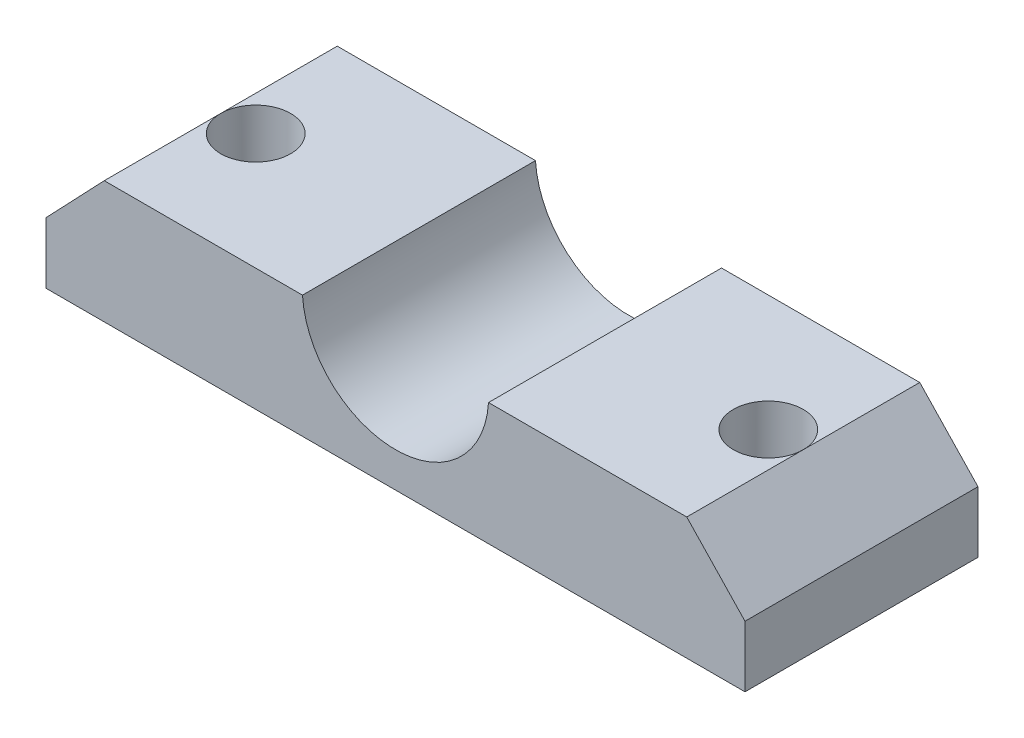
ISO-10303-21;
HEADER;
FILE_DESCRIPTION(('STEP AP214'),'2;1');
FILE_NAME('part.step','',(''),(''),'','','');
FILE_SCHEMA(('AUTOMOTIVE_DESIGN { 1 0 10303 214 1 1 1 1 }'));
ENDSEC;
DATA;
#1=APPLICATION_CONTEXT('core data for automotive mechanical design processes');
#2=APPLICATION_PROTOCOL_DEFINITION('international standard','automotive_design',2000,#1);
#3=PRODUCT_CONTEXT('',#1,'mechanical');
#4=PRODUCT('Part','Part','',(#3));
#5=PRODUCT_RELATED_PRODUCT_CATEGORY('part','',(#4));
#6=PRODUCT_DEFINITION_FORMATION('','',#4);
#7=PRODUCT_DEFINITION_CONTEXT('part definition',#1,'design');
#8=PRODUCT_DEFINITION('design','',#6,#7);
#9=PRODUCT_DEFINITION_SHAPE('','',#8);
#10=(LENGTH_UNIT() NAMED_UNIT(*) SI_UNIT(.MILLI.,.METRE.));
#11=(NAMED_UNIT(*) PLANE_ANGLE_UNIT() SI_UNIT($,.RADIAN.));
#12=(NAMED_UNIT(*) SI_UNIT($,.STERADIAN.) SOLID_ANGLE_UNIT());
#13=UNCERTAINTY_MEASURE_WITH_UNIT(LENGTH_MEASURE(1.E-05),#10,'distance_accuracy_value','');
#14=(GEOMETRIC_REPRESENTATION_CONTEXT(3) GLOBAL_UNCERTAINTY_ASSIGNED_CONTEXT((#13)) GLOBAL_UNIT_ASSIGNED_CONTEXT((#10,
#11,#12)) REPRESENTATION_CONTEXT('',''));
#15=CARTESIAN_POINT('',(0.,0.,0.));
#16=DIRECTION('',(0.,0.,1.));
#17=DIRECTION('',(1.,0.,0.));
#18=AXIS2_PLACEMENT_3D('',#15,#16,#17);
#19=CARTESIAN_POINT('',(0.,0.,10.));
#20=DIRECTION('',(0.,0.,-1.));
#21=DIRECTION('',(-1.,0.,0.));
#22=AXIS2_PLACEMENT_3D('',#19,#20,#21);
#23=PLANE('',#22);
#24=DIRECTION('',(1.,0.,0.));
#25=VECTOR('',#24,1.);
#26=CARTESIAN_POINT('',(0.,-0.250000000000002,10.));
#27=LINE('',#26,#25);
#28=CARTESIAN_POINT('',(-12.5,-0.250000000000002,10.));
#29=VERTEX_POINT('',#28);
#30=CARTESIAN_POINT('',(-3.99217985566783,-0.250000000000002,10.));
#31=VERTEX_POINT('',#30);
#32=EDGE_CURVE('E122',#29,#31,#27,.T.);
#33=ORIENTED_EDGE('',*,*,#32,.F.);
#34=DIRECTION('',(0.689655172413794,0.724137931034482,0.));
#35=VECTOR('',#34,1.);
#36=CARTESIAN_POINT('',(-6.42984542211651,6.12366230677765,10.));
#37=LINE('',#36,#35);
#38=CARTESIAN_POINT('',(-15.,-2.875,10.));
#39=VERTEX_POINT('',#38);
#40=EDGE_CURVE('E54',#39,#29,#37,.T.);
#41=ORIENTED_EDGE('',*,*,#40,.F.);
#42=DIRECTION('',(0.,-1.,0.));
#43=VECTOR('',#42,1.);
#44=CARTESIAN_POINT('',(-15.,-5.5,10.));
#45=LINE('',#44,#43);
#46=CARTESIAN_POINT('',(-15.,-5.5,10.));
#47=VERTEX_POINT('',#46);
#48=EDGE_CURVE('E119',#39,#47,#45,.T.);
#49=ORIENTED_EDGE('',*,*,#48,.T.);
#50=DIRECTION('',(1.,0.,0.));
#51=VECTOR('',#50,1.);
#52=CARTESIAN_POINT('',(-15.,-5.5,10.));
#53=LINE('',#52,#51);
#54=CARTESIAN_POINT('',(15.,-5.5,10.));
#55=VERTEX_POINT('',#54);
#56=EDGE_CURVE('E129',#47,#55,#53,.T.);
#57=ORIENTED_EDGE('',*,*,#56,.T.);
#58=DIRECTION('',(0.,1.,0.));
#59=VECTOR('',#58,1.);
#60=CARTESIAN_POINT('',(15.,-5.5,10.));
#61=LINE('',#60,#59);
#62=CARTESIAN_POINT('',(15.,-2.87499999999999,10.));
#63=VERTEX_POINT('',#62);
#64=EDGE_CURVE('E130',#55,#63,#61,.T.);
#65=ORIENTED_EDGE('',*,*,#64,.T.);
#66=DIRECTION('',(-0.689655172413793,0.724137931034483,0.));
#67=VECTOR('',#66,1.);
#68=CARTESIAN_POINT('',(6.42984542211654,6.12366230677765,10.));
#69=LINE('',#68,#67);
#70=CARTESIAN_POINT('',(12.5,-0.250000000000002,10.));
#71=VERTEX_POINT('',#70);
#72=EDGE_CURVE('E219',#63,#71,#69,.T.);
#73=ORIENTED_EDGE('',*,*,#72,.T.);
#74=DIRECTION('',(1.,0.,0.));
#75=VECTOR('',#74,1.);
#76=CARTESIAN_POINT('',(0.,-0.250000000000002,10.));
#77=LINE('',#76,#75);
#78=CARTESIAN_POINT('',(3.99217985566783,-0.250000000000002,10.));
#79=VERTEX_POINT('',#78);
#80=EDGE_CURVE('E204',#79,#71,#77,.T.);
#81=ORIENTED_EDGE('',*,*,#80,.F.);
#82=CARTESIAN_POINT('',(0.,0.,10.));
#83=DIRECTION('',(0.,0.,1.));
#84=DIRECTION('',(1.,0.,0.));
#85=AXIS2_PLACEMENT_3D('',#82,#83,#84);
#86=CIRCLE('',#85,4.);
#87=EDGE_CURVE('E143',#31,#79,#86,.T.);
#88=ORIENTED_EDGE('',*,*,#87,.F.);
#89=EDGE_LOOP('',(#33,#41,#49,#57,#65,#73,#81,#88));
#90=FACE_BOUND('',#89,.T.);
#91=ADVANCED_FACE('F39',(#90),#23,.F.);
#92=CARTESIAN_POINT('',(0.,0.,0.));
#93=DIRECTION('',(0.,0.,-1.));
#94=DIRECTION('',(-1.,0.,0.));
#95=AXIS2_PLACEMENT_3D('',#92,#93,#94);
#96=PLANE('',#95);
#97=DIRECTION('',(-0.689655172413794,-0.724137931034482,0.));
#98=VECTOR('',#97,1.);
#99=CARTESIAN_POINT('',(-6.42984542211651,6.12366230677765,0.));
#100=LINE('',#99,#98);
#101=CARTESIAN_POINT('',(-12.5,-0.250000000000002,0.));
#102=VERTEX_POINT('',#101);
#103=CARTESIAN_POINT('',(-15.,-2.875,0.));
#104=VERTEX_POINT('',#103);
#105=EDGE_CURVE('E111',#102,#104,#100,.T.);
#106=ORIENTED_EDGE('',*,*,#105,.F.);
#107=DIRECTION('',(-1.,0.,0.));
#108=VECTOR('',#107,1.);
#109=CARTESIAN_POINT('',(0.,-0.250000000000002,0.));
#110=LINE('',#109,#108);
#111=CARTESIAN_POINT('',(-3.99217985566783,-0.250000000000002,0.));
#112=VERTEX_POINT('',#111);
#113=EDGE_CURVE('E161',#112,#102,#110,.T.);
#114=ORIENTED_EDGE('',*,*,#113,.F.);
#115=CARTESIAN_POINT('',(0.,0.,0.));
#116=DIRECTION('',(0.,0.,1.));
#117=DIRECTION('',(1.,0.,0.));
#118=AXIS2_PLACEMENT_3D('',#115,#116,#117);
#119=CIRCLE('',#118,4.);
#120=CARTESIAN_POINT('',(3.99217985566783,-0.250000000000002,0.));
#121=VERTEX_POINT('',#120);
#122=EDGE_CURVE('E157',#112,#121,#119,.T.);
#123=ORIENTED_EDGE('',*,*,#122,.T.);
#124=DIRECTION('',(-1.,0.,0.));
#125=VECTOR('',#124,1.);
#126=CARTESIAN_POINT('',(0.,-0.250000000000002,0.));
#127=LINE('',#126,#125);
#128=CARTESIAN_POINT('',(12.5,-0.250000000000002,0.));
#129=VERTEX_POINT('',#128);
#130=EDGE_CURVE('E154',#129,#121,#127,.T.);
#131=ORIENTED_EDGE('',*,*,#130,.F.);
#132=DIRECTION('',(0.689655172413793,-0.724137931034483,0.));
#133=VECTOR('',#132,1.);
#134=CARTESIAN_POINT('',(6.42984542211654,6.12366230677765,0.));
#135=LINE('',#134,#133);
#136=CARTESIAN_POINT('',(15.,-2.87499999999999,0.));
#137=VERTEX_POINT('',#136);
#138=EDGE_CURVE('E115',#129,#137,#135,.T.);
#139=ORIENTED_EDGE('',*,*,#138,.T.);
#140=DIRECTION('',(0.,1.,0.));
#141=VECTOR('',#140,1.);
#142=CARTESIAN_POINT('',(15.,-5.5,0.));
#143=LINE('',#142,#141);
#144=CARTESIAN_POINT('',(15.,-5.5,0.));
#145=VERTEX_POINT('',#144);
#146=EDGE_CURVE('E139',#145,#137,#143,.T.);
#147=ORIENTED_EDGE('',*,*,#146,.F.);
#148=DIRECTION('',(1.,0.,0.));
#149=VECTOR('',#148,1.);
#150=CARTESIAN_POINT('',(-15.,-5.5,0.));
#151=LINE('',#150,#149);
#152=CARTESIAN_POINT('',(-15.,-5.5,0.));
#153=VERTEX_POINT('',#152);
#154=EDGE_CURVE('E135',#153,#145,#151,.T.);
#155=ORIENTED_EDGE('',*,*,#154,.F.);
#156=DIRECTION('',(0.,-1.,0.));
#157=VECTOR('',#156,1.);
#158=CARTESIAN_POINT('',(-15.,-5.5,0.));
#159=LINE('',#158,#157);
#160=EDGE_CURVE('E142',#104,#153,#159,.T.);
#161=ORIENTED_EDGE('',*,*,#160,.F.);
#162=EDGE_LOOP('',(#106,#114,#123,#131,#139,#147,#155,#161));
#163=FACE_BOUND('',#162,.T.);
#164=ADVANCED_FACE('F195',(#163),#96,.T.);
#165=CARTESIAN_POINT('',(15.,-5.5,10.));
#166=DIRECTION('',(-1.,0.,0.));
#167=DIRECTION('',(0.,0.,1.));
#168=AXIS2_PLACEMENT_3D('',#165,#166,#167);
#169=PLANE('',#168);
#170=DIRECTION('',(0.,0.,1.));
#171=VECTOR('',#170,1.);
#172=CARTESIAN_POINT('',(15.,-2.87499999999999,-7.));
#173=LINE('',#172,#171);
#174=EDGE_CURVE('E123',#137,#63,#173,.T.);
#175=ORIENTED_EDGE('',*,*,#174,.T.);
#176=ORIENTED_EDGE('',*,*,#64,.F.);
#177=DIRECTION('',(0.,0.,-1.));
#178=VECTOR('',#177,1.);
#179=CARTESIAN_POINT('',(15.,-5.5,10.));
#180=LINE('',#179,#178);
#181=EDGE_CURVE('E132',#55,#145,#180,.T.);
#182=ORIENTED_EDGE('',*,*,#181,.T.);
#183=ORIENTED_EDGE('',*,*,#146,.T.);
#184=EDGE_LOOP('',(#175,#176,#182,#183));
#185=FACE_BOUND('',#184,.T.);
#186=ADVANCED_FACE('F41',(#185),#169,.F.);
#187=CARTESIAN_POINT('',(0.,-0.250000000000002,-7.));
#188=DIRECTION('',(0.,-1.,0.));
#189=DIRECTION('',(0.,0.,-1.));
#190=AXIS2_PLACEMENT_3D('',#187,#188,#189);
#191=PLANE('',#190);
#192=DIRECTION('',(0.,0.,1.));
#193=VECTOR('',#192,1.);
#194=CARTESIAN_POINT('',(12.5,-0.250000000000002,-7.));
#195=LINE('',#194,#193);
#196=CARTESIAN_POINT('',(12.5,-0.250000000000002,4.99999999999999));
#197=VERTEX_POINT('',#196);
#198=EDGE_CURVE('E62',#129,#197,#195,.T.);
#199=ORIENTED_EDGE('',*,*,#198,.F.);
#200=ORIENTED_EDGE('',*,*,#130,.T.);
#201=DIRECTION('',(0.,0.,1.));
#202=VECTOR('',#201,1.);
#203=CARTESIAN_POINT('',(3.99217985566783,-0.250000000000002,-7.));
#204=LINE('',#203,#202);
#205=EDGE_CURVE('E162',#121,#79,#204,.T.);
#206=ORIENTED_EDGE('',*,*,#205,.T.);
#207=ORIENTED_EDGE('',*,*,#80,.T.);
#208=EDGE_CURVE('E149',#197,#71,#195,.T.);
#209=ORIENTED_EDGE('',*,*,#208,.F.);
#210=CARTESIAN_POINT('',(11.,-0.250000000000002,4.99999999999999));
#211=DIRECTION('',(0.,-1.,0.));
#212=DIRECTION('',(0.,0.,-1.));
#213=AXIS2_PLACEMENT_3D('',#210,#211,#212);
#214=CIRCLE('',#213,1.5);
#215=EDGE_CURVE('E163',#197,#197,#214,.F.);
#216=ORIENTED_EDGE('',*,*,#215,.F.);
#217=EDGE_LOOP('',(#199,#200,#206,#207,#209,#216));
#218=FACE_BOUND('',#217,.T.);
#219=ADVANCED_FACE('F218',(#218),#191,.F.);
#220=CARTESIAN_POINT('',(-15.,-5.5,10.));
#221=DIRECTION('',(1.,0.,0.));
#222=DIRECTION('',(0.,0.,-1.));
#223=AXIS2_PLACEMENT_3D('',#220,#221,#222);
#224=PLANE('',#223);
#225=ORIENTED_EDGE('',*,*,#48,.F.);
#226=DIRECTION('',(0.,0.,1.));
#227=VECTOR('',#226,1.);
#228=CARTESIAN_POINT('',(-15.,-2.875,-7.));
#229=LINE('',#228,#227);
#230=EDGE_CURVE('E108',#104,#39,#229,.T.);
#231=ORIENTED_EDGE('',*,*,#230,.F.);
#232=ORIENTED_EDGE('',*,*,#160,.T.);
#233=DIRECTION('',(0.,0.,-1.));
#234=VECTOR('',#233,1.);
#235=CARTESIAN_POINT('',(-15.,-5.5,10.));
#236=LINE('',#235,#234);
#237=EDGE_CURVE('E127',#47,#153,#236,.T.);
#238=ORIENTED_EDGE('',*,*,#237,.F.);
#239=EDGE_LOOP('',(#225,#231,#232,#238));
#240=FACE_BOUND('',#239,.T.);
#241=ADVANCED_FACE('F125',(#240),#224,.F.);
#242=CARTESIAN_POINT('',(-15.,-5.5,10.));
#243=DIRECTION('',(0.,1.,0.));
#244=DIRECTION('',(0.,0.,1.));
#245=AXIS2_PLACEMENT_3D('',#242,#243,#244);
#246=PLANE('',#245);
#247=CARTESIAN_POINT('',(-11.,-5.5,5.));
#248=DIRECTION('',(0.,1.,0.));
#249=DIRECTION('',(0.,0.,1.));
#250=AXIS2_PLACEMENT_3D('',#247,#248,#249);
#251=CIRCLE('',#250,1.5);
#252=CARTESIAN_POINT('',(-11.,-5.5,6.5));
#253=VERTEX_POINT('',#252);
#254=EDGE_CURVE('E153',#253,#253,#251,.T.);
#255=ORIENTED_EDGE('',*,*,#254,.T.);
#256=EDGE_LOOP('',(#255));
#257=FACE_BOUND('',#256,.T.);
#258=CARTESIAN_POINT('',(11.,-5.5,4.99999999999999));
#259=DIRECTION('',(0.,1.,0.));
#260=DIRECTION('',(0.,0.,1.));
#261=AXIS2_PLACEMENT_3D('',#258,#259,#260);
#262=CIRCLE('',#261,1.5);
#263=CARTESIAN_POINT('',(11.,-5.5,6.49999999999999));
#264=VERTEX_POINT('',#263);
#265=EDGE_CURVE('E150',#264,#264,#262,.T.);
#266=ORIENTED_EDGE('',*,*,#265,.T.);
#267=EDGE_LOOP('',(#266));
#268=FACE_BOUND('',#267,.T.);
#269=ORIENTED_EDGE('',*,*,#154,.T.);
#270=ORIENTED_EDGE('',*,*,#181,.F.);
#271=ORIENTED_EDGE('',*,*,#56,.F.);
#272=ORIENTED_EDGE('',*,*,#237,.T.);
#273=EDGE_LOOP('',(#269,#270,#271,#272));
#274=FACE_BOUND('',#273,.T.);
#275=ADVANCED_FACE('F180',(#257,#268,#274),#246,.F.);
#276=CARTESIAN_POINT('',(0.,0.,10.));
#277=DIRECTION('',(0.,0.,-1.));
#278=DIRECTION('',(-1.,0.,0.));
#279=AXIS2_PLACEMENT_3D('',#276,#277,#278);
#280=CYLINDRICAL_SURFACE('',#279,4.);
#281=ORIENTED_EDGE('',*,*,#205,.F.);
#282=ORIENTED_EDGE('',*,*,#122,.F.);
#283=DIRECTION('',(0.,0.,1.));
#284=VECTOR('',#283,1.);
#285=CARTESIAN_POINT('',(-3.99217985566783,-0.250000000000002,-7.));
#286=LINE('',#285,#284);
#287=EDGE_CURVE('E207',#112,#31,#286,.T.);
#288=ORIENTED_EDGE('',*,*,#287,.T.);
#289=ORIENTED_EDGE('',*,*,#87,.T.);
#290=EDGE_LOOP('',(#281,#282,#288,#289));
#291=FACE_BOUND('',#290,.T.);
#292=ADVANCED_FACE('F183',(#291),#280,.F.);
#293=CARTESIAN_POINT('',(11.,-11.5,4.99999999999999));
#294=DIRECTION('',(0.,1.,0.));
#295=DIRECTION('',(0.,0.,1.));
#296=AXIS2_PLACEMENT_3D('',#293,#294,#295);
#297=CYLINDRICAL_SURFACE('',#296,1.5);
#298=ORIENTED_EDGE('',*,*,#215,.T.);
#299=EDGE_LOOP('',(#298));
#300=FACE_BOUND('',#299,.T.);
#301=ORIENTED_EDGE('',*,*,#265,.F.);
#302=EDGE_LOOP('',(#301));
#303=FACE_BOUND('',#302,.T.);
#304=ADVANCED_FACE('F176',(#300,#303),#297,.F.);
#305=CARTESIAN_POINT('',(-11.,-11.5,5.));
#306=DIRECTION('',(0.,1.,0.));
#307=DIRECTION('',(0.,0.,1.));
#308=AXIS2_PLACEMENT_3D('',#305,#306,#307);
#309=CYLINDRICAL_SURFACE('',#308,1.5);
#310=CARTESIAN_POINT('',(-11.,-0.250000000000002,5.));
#311=DIRECTION('',(0.,-1.,0.));
#312=DIRECTION('',(0.,0.,-1.));
#313=AXIS2_PLACEMENT_3D('',#310,#311,#312);
#314=CIRCLE('',#313,1.5);
#315=CARTESIAN_POINT('',(-12.5,-0.250000000000002,5.));
#316=VERTEX_POINT('',#315);
#317=EDGE_CURVE('E158',#316,#316,#314,.F.);
#318=ORIENTED_EDGE('',*,*,#317,.T.);
#319=EDGE_LOOP('',(#318));
#320=FACE_BOUND('',#319,.T.);
#321=ORIENTED_EDGE('',*,*,#254,.F.);
#322=EDGE_LOOP('',(#321));
#323=FACE_BOUND('',#322,.T.);
#324=ADVANCED_FACE('F173',(#320,#323),#309,.F.);
#325=CARTESIAN_POINT('',(0.,-0.250000000000002,-7.));
#326=DIRECTION('',(0.,-1.,0.));
#327=DIRECTION('',(0.,0.,-1.));
#328=AXIS2_PLACEMENT_3D('',#325,#326,#327);
#329=PLANE('',#328);
#330=ORIENTED_EDGE('',*,*,#113,.T.);
#331=DIRECTION('',(0.,0.,1.));
#332=VECTOR('',#331,1.);
#333=CARTESIAN_POINT('',(-12.5,-0.250000000000002,-7.));
#334=LINE('',#333,#332);
#335=EDGE_CURVE('E11',#102,#316,#334,.T.);
#336=ORIENTED_EDGE('',*,*,#335,.T.);
#337=ORIENTED_EDGE('',*,*,#317,.F.);
#338=EDGE_CURVE('E43',#316,#29,#334,.T.);
#339=ORIENTED_EDGE('',*,*,#338,.T.);
#340=ORIENTED_EDGE('',*,*,#32,.T.);
#341=ORIENTED_EDGE('',*,*,#287,.F.);
#342=EDGE_LOOP('',(#330,#336,#337,#339,#340,#341));
#343=FACE_BOUND('',#342,.T.);
#344=ADVANCED_FACE('F169',(#343),#329,.F.);
#345=CARTESIAN_POINT('',(6.42984542211654,6.12366230677765,-7.));
#346=DIRECTION('',(0.724137931034483,0.689655172413793,0.));
#347=DIRECTION('',(-0.689655172413793,0.724137931034483,0.));
#348=AXIS2_PLACEMENT_3D('',#345,#346,#347);
#349=PLANE('',#348);
#350=ORIENTED_EDGE('',*,*,#198,.T.);
#351=ORIENTED_EDGE('',*,*,#208,.T.);
#352=ORIENTED_EDGE('',*,*,#72,.F.);
#353=ORIENTED_EDGE('',*,*,#174,.F.);
#354=ORIENTED_EDGE('',*,*,#138,.F.);
#355=EDGE_LOOP('',(#350,#351,#352,#353,#354));
#356=FACE_BOUND('',#355,.T.);
#357=ADVANCED_FACE('F220',(#356),#349,.T.);
#358=CARTESIAN_POINT('',(-6.42984542211651,6.12366230677765,-7.));
#359=DIRECTION('',(0.724137931034482,-0.689655172413794,0.));
#360=DIRECTION('',(0.689655172413794,0.724137931034482,0.));
#361=AXIS2_PLACEMENT_3D('',#358,#359,#360);
#362=PLANE('',#361);
#363=ORIENTED_EDGE('',*,*,#105,.T.);
#364=ORIENTED_EDGE('',*,*,#230,.T.);
#365=ORIENTED_EDGE('',*,*,#40,.T.);
#366=ORIENTED_EDGE('',*,*,#338,.F.);
#367=ORIENTED_EDGE('',*,*,#335,.F.);
#368=EDGE_LOOP('',(#363,#364,#365,#366,#367));
#369=FACE_BOUND('',#368,.T.);
#370=ADVANCED_FACE('F109',(#369),#362,.F.);
#371=CLOSED_SHELL('',(#91,#164,#186,#219,#241,#275,#292,#304,#324,#344,#357,#370));
#372=MANIFOLD_SOLID_BREP('B2',#371);
#373=ADVANCED_BREP_SHAPE_REPRESENTATION('',(#18,#372),#14);
#374=SHAPE_DEFINITION_REPRESENTATION(#9,#373);
ENDSEC;
END-ISO-10303-21;
